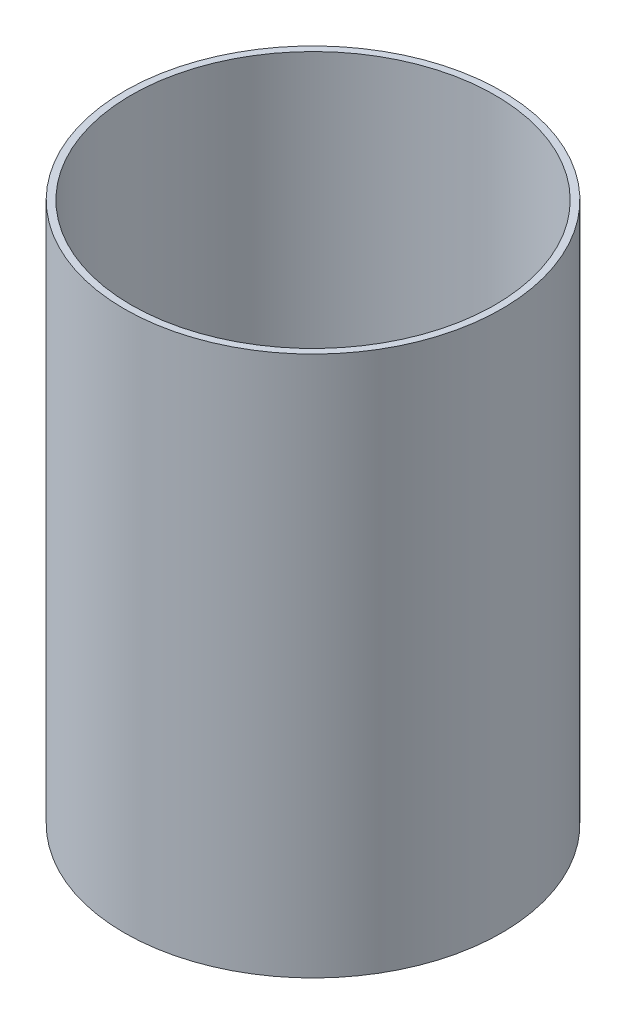
ISO-10303-21;
HEADER;
FILE_DESCRIPTION(('STEP AP214'),'2;1');
FILE_NAME('part.step','',(''),(''),'','','');
FILE_SCHEMA(('AUTOMOTIVE_DESIGN { 1 0 10303 214 1 1 1 1 }'));
ENDSEC;
DATA;
#1=APPLICATION_CONTEXT('core data for automotive mechanical design processes');
#2=APPLICATION_PROTOCOL_DEFINITION('international standard','automotive_design',2000,#1);
#3=PRODUCT_CONTEXT('',#1,'mechanical');
#4=PRODUCT('Part','Part','',(#3));
#5=PRODUCT_RELATED_PRODUCT_CATEGORY('part','',(#4));
#6=PRODUCT_DEFINITION_FORMATION('','',#4);
#7=PRODUCT_DEFINITION_CONTEXT('part definition',#1,'design');
#8=PRODUCT_DEFINITION('design','',#6,#7);
#9=PRODUCT_DEFINITION_SHAPE('','',#8);
#10=(LENGTH_UNIT() NAMED_UNIT(*) SI_UNIT(.MILLI.,.METRE.));
#11=(NAMED_UNIT(*) PLANE_ANGLE_UNIT() SI_UNIT($,.RADIAN.));
#12=(NAMED_UNIT(*) SI_UNIT($,.STERADIAN.) SOLID_ANGLE_UNIT());
#13=UNCERTAINTY_MEASURE_WITH_UNIT(LENGTH_MEASURE(1.E-05),#10,'distance_accuracy_value','');
#14=(GEOMETRIC_REPRESENTATION_CONTEXT(3) GLOBAL_UNCERTAINTY_ASSIGNED_CONTEXT((#13)) GLOBAL_UNIT_ASSIGNED_CONTEXT((#10,
#11,#12)) REPRESENTATION_CONTEXT('',''));
#15=CARTESIAN_POINT('',(0.,0.,0.));
#16=DIRECTION('',(0.,0.,1.));
#17=DIRECTION('',(1.,0.,0.));
#18=AXIS2_PLACEMENT_3D('',#15,#16,#17);
#19=CARTESIAN_POINT('',(0.,200.,0.));
#20=DIRECTION('',(0.,1.,0.));
#21=DIRECTION('',(0.,0.,1.));
#22=AXIS2_PLACEMENT_3D('',#19,#20,#21);
#23=PLANE('',#22);
#24=CARTESIAN_POINT('',(0.,200.,0.));
#25=DIRECTION('',(0.,1.,0.));
#26=DIRECTION('',(0.,0.,1.));
#27=AXIS2_PLACEMENT_3D('',#24,#25,#26);
#28=CIRCLE('',#27,69.85);
#29=CARTESIAN_POINT('',(0.,200.,69.85));
#30=VERTEX_POINT('',#29);
#31=EDGE_CURVE('E11',#30,#30,#28,.T.);
#32=ORIENTED_EDGE('',*,*,#31,.T.);
#33=EDGE_LOOP('',(#32));
#34=FACE_BOUND('',#33,.T.);
#35=CARTESIAN_POINT('',(0.,200.,0.));
#36=DIRECTION('',(0.,1.,0.));
#37=DIRECTION('',(0.,0.,1.));
#38=AXIS2_PLACEMENT_3D('',#35,#36,#37);
#39=CIRCLE('',#38,67.31);
#40=CARTESIAN_POINT('',(0.,200.,67.31));
#41=VERTEX_POINT('',#40);
#42=EDGE_CURVE('E52',#41,#41,#39,.T.);
#43=ORIENTED_EDGE('',*,*,#42,.F.);
#44=EDGE_LOOP('',(#43));
#45=FACE_BOUND('',#44,.T.);
#46=ADVANCED_FACE('F41',(#34,#45),#23,.T.);
#47=CARTESIAN_POINT('',(0.,0.,0.));
#48=DIRECTION('',(0.,1.,0.));
#49=DIRECTION('',(0.,0.,1.));
#50=AXIS2_PLACEMENT_3D('',#47,#48,#49);
#51=PLANE('',#50);
#52=CARTESIAN_POINT('',(0.,0.,0.));
#53=DIRECTION('',(0.,1.,0.));
#54=DIRECTION('',(0.,0.,1.));
#55=AXIS2_PLACEMENT_3D('',#52,#53,#54);
#56=CIRCLE('',#55,69.85);
#57=CARTESIAN_POINT('',(0.,0.,69.85));
#58=VERTEX_POINT('',#57);
#59=EDGE_CURVE('E45',#58,#58,#56,.T.);
#60=ORIENTED_EDGE('',*,*,#59,.F.);
#61=EDGE_LOOP('',(#60));
#62=FACE_BOUND('',#61,.T.);
#63=CARTESIAN_POINT('',(0.,0.,0.));
#64=DIRECTION('',(0.,1.,0.));
#65=DIRECTION('',(0.,0.,1.));
#66=AXIS2_PLACEMENT_3D('',#63,#64,#65);
#67=CIRCLE('',#66,67.31);
#68=CARTESIAN_POINT('',(0.,0.,67.31));
#69=VERTEX_POINT('',#68);
#70=EDGE_CURVE('E53',#69,#69,#67,.T.);
#71=ORIENTED_EDGE('',*,*,#70,.T.);
#72=EDGE_LOOP('',(#71));
#73=FACE_BOUND('',#72,.T.);
#74=ADVANCED_FACE('F65',(#62,#73),#51,.F.);
#75=CARTESIAN_POINT('',(0.,200.,0.));
#76=DIRECTION('',(0.,-1.,0.));
#77=DIRECTION('',(0.,0.,-1.));
#78=AXIS2_PLACEMENT_3D('',#75,#76,#77);
#79=CYLINDRICAL_SURFACE('',#78,69.85);
#80=ORIENTED_EDGE('',*,*,#31,.F.);
#81=EDGE_LOOP('',(#80));
#82=FACE_BOUND('',#81,.T.);
#83=ORIENTED_EDGE('',*,*,#59,.T.);
#84=EDGE_LOOP('',(#83));
#85=FACE_BOUND('',#84,.T.);
#86=ADVANCED_FACE('F43',(#82,#85),#79,.T.);
#87=CARTESIAN_POINT('',(0.,200.,0.));
#88=DIRECTION('',(0.,-1.,0.));
#89=DIRECTION('',(0.,0.,-1.));
#90=AXIS2_PLACEMENT_3D('',#87,#88,#89);
#91=CYLINDRICAL_SURFACE('',#90,67.31);
#92=ORIENTED_EDGE('',*,*,#42,.T.);
#93=EDGE_LOOP('',(#92));
#94=FACE_BOUND('',#93,.T.);
#95=ORIENTED_EDGE('',*,*,#70,.F.);
#96=EDGE_LOOP('',(#95));
#97=FACE_BOUND('',#96,.T.);
#98=ADVANCED_FACE('F61',(#94,#97),#91,.F.);
#99=CLOSED_SHELL('',(#46,#74,#86,#98));
#100=MANIFOLD_SOLID_BREP('B2',#99);
#101=ADVANCED_BREP_SHAPE_REPRESENTATION('',(#18,#100),#14);
#102=SHAPE_DEFINITION_REPRESENTATION(#9,#101);
ENDSEC;
END-ISO-10303-21;
